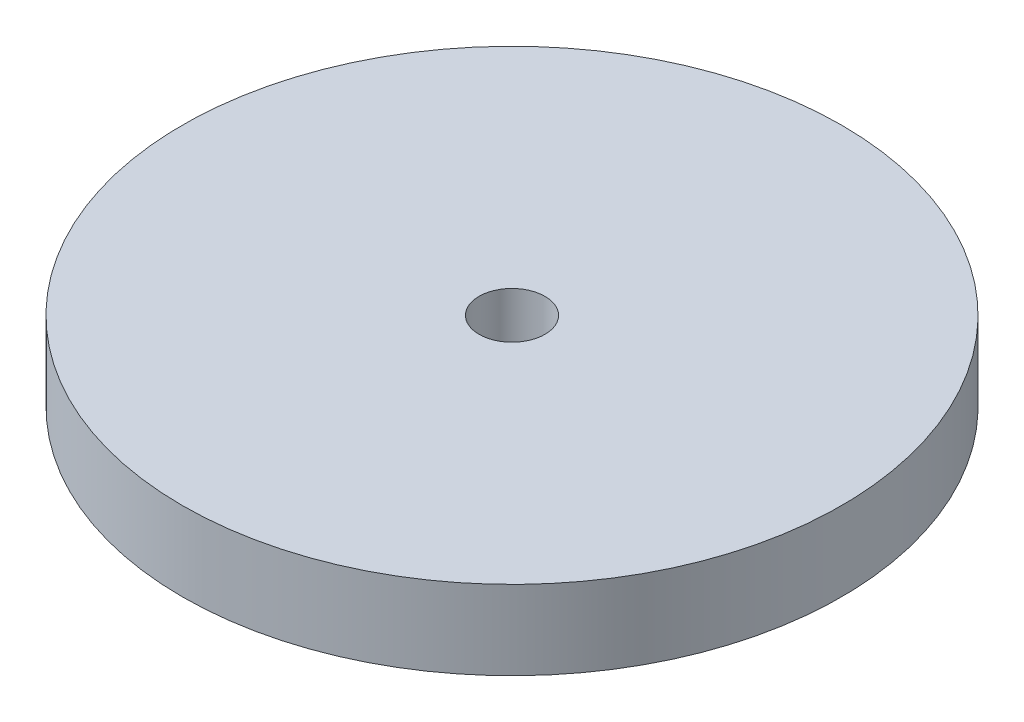
ISO-10303-21;
HEADER;
FILE_DESCRIPTION(('STEP AP214'),'2;1');
FILE_NAME('part.step','',(''),(''),'','','');
FILE_SCHEMA(('AUTOMOTIVE_DESIGN { 1 0 10303 214 1 1 1 1 }'));
ENDSEC;
DATA;
#1=APPLICATION_CONTEXT('core data for automotive mechanical design processes');
#2=APPLICATION_PROTOCOL_DEFINITION('international standard','automotive_design',2000,#1);
#3=PRODUCT_CONTEXT('',#1,'mechanical');
#4=PRODUCT('Part','Part','',(#3));
#5=PRODUCT_RELATED_PRODUCT_CATEGORY('part','',(#4));
#6=PRODUCT_DEFINITION_FORMATION('','',#4);
#7=PRODUCT_DEFINITION_CONTEXT('part definition',#1,'design');
#8=PRODUCT_DEFINITION('design','',#6,#7);
#9=PRODUCT_DEFINITION_SHAPE('','',#8);
#10=(LENGTH_UNIT() NAMED_UNIT(*) SI_UNIT(.MILLI.,.METRE.));
#11=(NAMED_UNIT(*) PLANE_ANGLE_UNIT() SI_UNIT($,.RADIAN.));
#12=(NAMED_UNIT(*) SI_UNIT($,.STERADIAN.) SOLID_ANGLE_UNIT());
#13=UNCERTAINTY_MEASURE_WITH_UNIT(LENGTH_MEASURE(1.E-05),#10,'distance_accuracy_value','');
#14=(GEOMETRIC_REPRESENTATION_CONTEXT(3) GLOBAL_UNCERTAINTY_ASSIGNED_CONTEXT((#13)) GLOBAL_UNIT_ASSIGNED_CONTEXT((#10,
#11,#12)) REPRESENTATION_CONTEXT('',''));
#15=CARTESIAN_POINT('',(0.,0.,0.));
#16=DIRECTION('',(0.,0.,1.));
#17=DIRECTION('',(1.,0.,0.));
#18=AXIS2_PLACEMENT_3D('',#15,#16,#17);
#19=CARTESIAN_POINT('',(0.,15.,0.));
#20=DIRECTION('',(0.,1.,0.));
#21=DIRECTION('',(0.,0.,1.));
#22=AXIS2_PLACEMENT_3D('',#19,#20,#21);
#23=PLANE('',#22);
#24=CARTESIAN_POINT('',(0.,15.,0.));
#25=DIRECTION('',(0.,1.,0.));
#26=DIRECTION('',(0.,0.,1.));
#27=AXIS2_PLACEMENT_3D('',#24,#25,#26);
#28=CIRCLE('',#27,125.);
#29=CARTESIAN_POINT('',(0.,15.,125.));
#30=VERTEX_POINT('',#29);
#31=EDGE_CURVE('E10',#30,#30,#28,.T.);
#32=ORIENTED_EDGE('',*,*,#31,.T.);
#33=EDGE_LOOP('',(#32));
#34=FACE_BOUND('',#33,.T.);
#35=CARTESIAN_POINT('',(0.,15.,0.));
#36=DIRECTION('',(0.,1.,0.));
#37=DIRECTION('',(0.,0.,1.));
#38=AXIS2_PLACEMENT_3D('',#35,#36,#37);
#39=CIRCLE('',#38,12.5);
#40=CARTESIAN_POINT('',(0.,15.,12.5));
#41=VERTEX_POINT('',#40);
#42=EDGE_CURVE('E54',#41,#41,#39,.T.);
#43=ORIENTED_EDGE('',*,*,#42,.F.);
#44=EDGE_LOOP('',(#43));
#45=FACE_BOUND('',#44,.T.);
#46=ADVANCED_FACE('F39',(#34,#45),#23,.T.);
#47=CARTESIAN_POINT('',(0.,-15.,0.));
#48=DIRECTION('',(0.,1.,0.));
#49=DIRECTION('',(0.,0.,1.));
#50=AXIS2_PLACEMENT_3D('',#47,#48,#49);
#51=PLANE('',#50);
#52=CARTESIAN_POINT('',(0.,-15.,0.));
#53=DIRECTION('',(0.,1.,0.));
#54=DIRECTION('',(0.,0.,1.));
#55=AXIS2_PLACEMENT_3D('',#52,#53,#54);
#56=CIRCLE('',#55,125.);
#57=CARTESIAN_POINT('',(0.,-15.,125.));
#58=VERTEX_POINT('',#57);
#59=EDGE_CURVE('E43',#58,#58,#56,.T.);
#60=ORIENTED_EDGE('',*,*,#59,.F.);
#61=EDGE_LOOP('',(#60));
#62=FACE_BOUND('',#61,.T.);
#63=CARTESIAN_POINT('',(0.,-15.,0.));
#64=DIRECTION('',(0.,1.,0.));
#65=DIRECTION('',(0.,0.,1.));
#66=AXIS2_PLACEMENT_3D('',#63,#64,#65);
#67=CIRCLE('',#66,12.5);
#68=CARTESIAN_POINT('',(0.,-15.,12.5));
#69=VERTEX_POINT('',#68);
#70=EDGE_CURVE('E56',#69,#69,#67,.T.);
#71=ORIENTED_EDGE('',*,*,#70,.T.);
#72=EDGE_LOOP('',(#71));
#73=FACE_BOUND('',#72,.T.);
#74=ADVANCED_FACE('F70',(#62,#73),#51,.F.);
#75=CARTESIAN_POINT('',(0.,15.,0.));
#76=DIRECTION('',(0.,-1.,0.));
#77=DIRECTION('',(0.,0.,-1.));
#78=AXIS2_PLACEMENT_3D('',#75,#76,#77);
#79=CYLINDRICAL_SURFACE('',#78,125.);
#80=ORIENTED_EDGE('',*,*,#31,.F.);
#81=EDGE_LOOP('',(#80));
#82=FACE_BOUND('',#81,.T.);
#83=ORIENTED_EDGE('',*,*,#59,.T.);
#84=EDGE_LOOP('',(#83));
#85=FACE_BOUND('',#84,.T.);
#86=ADVANCED_FACE('F41',(#82,#85),#79,.T.);
#87=CARTESIAN_POINT('',(0.,15.,0.));
#88=DIRECTION('',(0.,-1.,0.));
#89=DIRECTION('',(0.,0.,-1.));
#90=AXIS2_PLACEMENT_3D('',#87,#88,#89);
#91=CYLINDRICAL_SURFACE('',#90,12.5);
#92=ORIENTED_EDGE('',*,*,#42,.T.);
#93=EDGE_LOOP('',(#92));
#94=FACE_BOUND('',#93,.T.);
#95=ORIENTED_EDGE('',*,*,#70,.F.);
#96=EDGE_LOOP('',(#95));
#97=FACE_BOUND('',#96,.T.);
#98=ADVANCED_FACE('F66',(#94,#97),#91,.F.);
#99=CLOSED_SHELL('',(#46,#74,#86,#98));
#100=MANIFOLD_SOLID_BREP('B2',#99);
#101=ADVANCED_BREP_SHAPE_REPRESENTATION('',(#18,#100),#14);
#102=SHAPE_DEFINITION_REPRESENTATION(#9,#101);
ENDSEC;
END-ISO-10303-21;
